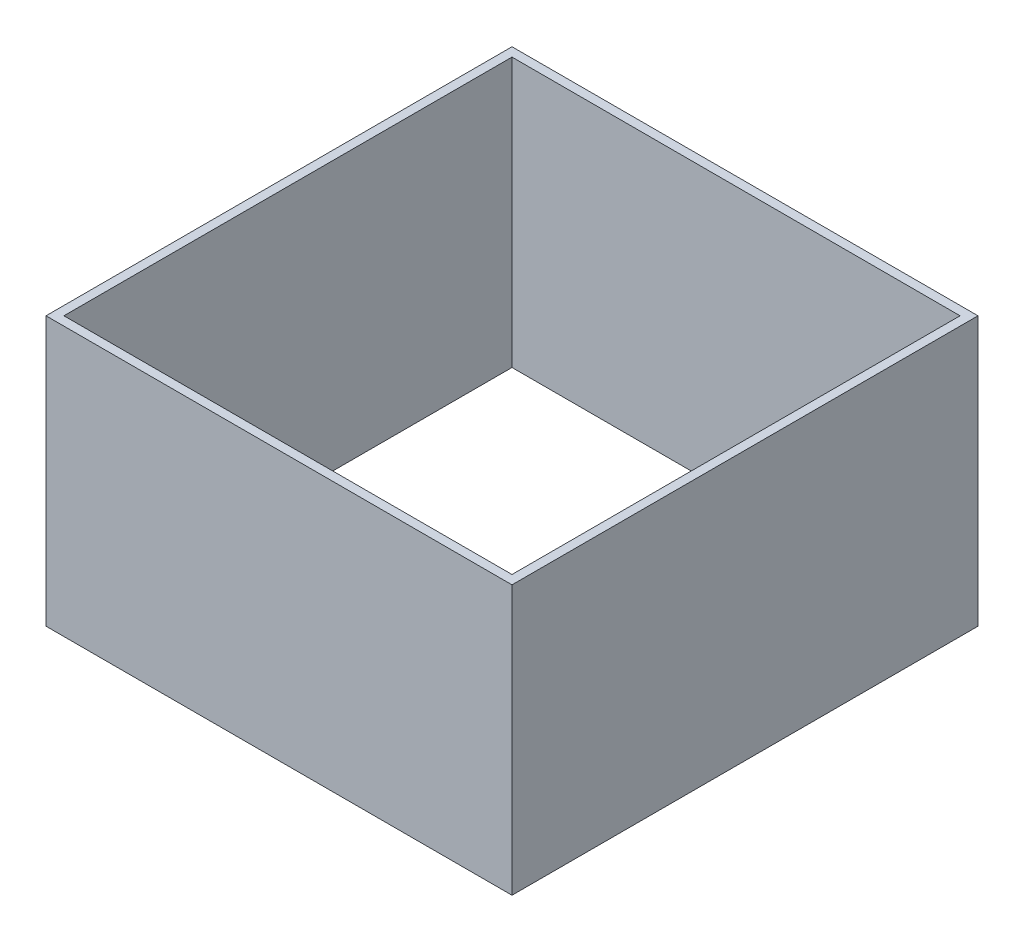
ISO-10303-21;
HEADER;
FILE_DESCRIPTION(('STEP AP214'),'2;1');
FILE_NAME('part.step','',(''),(''),'','','');
FILE_SCHEMA(('AUTOMOTIVE_DESIGN { 1 0 10303 214 1 1 1 1 }'));
ENDSEC;
DATA;
#1=APPLICATION_CONTEXT('core data for automotive mechanical design processes');
#2=APPLICATION_PROTOCOL_DEFINITION('international standard','automotive_design',2000,#1);
#3=PRODUCT_CONTEXT('',#1,'mechanical');
#4=PRODUCT('Part','Part','',(#3));
#5=PRODUCT_RELATED_PRODUCT_CATEGORY('part','',(#4));
#6=PRODUCT_DEFINITION_FORMATION('','',#4);
#7=PRODUCT_DEFINITION_CONTEXT('part definition',#1,'design');
#8=PRODUCT_DEFINITION('design','',#6,#7);
#9=PRODUCT_DEFINITION_SHAPE('','',#8);
#10=(LENGTH_UNIT() NAMED_UNIT(*) SI_UNIT(.MILLI.,.METRE.));
#11=(NAMED_UNIT(*) PLANE_ANGLE_UNIT() SI_UNIT($,.RADIAN.));
#12=(NAMED_UNIT(*) SI_UNIT($,.STERADIAN.) SOLID_ANGLE_UNIT());
#13=UNCERTAINTY_MEASURE_WITH_UNIT(LENGTH_MEASURE(1.E-05),#10,'distance_accuracy_value','');
#14=(GEOMETRIC_REPRESENTATION_CONTEXT(3) GLOBAL_UNCERTAINTY_ASSIGNED_CONTEXT((#13)) GLOBAL_UNIT_ASSIGNED_CONTEXT((#10,
#11,#12)) REPRESENTATION_CONTEXT('',''));
#15=CARTESIAN_POINT('',(0.,0.,0.));
#16=DIRECTION('',(0.,0.,1.));
#17=DIRECTION('',(1.,0.,0.));
#18=AXIS2_PLACEMENT_3D('',#15,#16,#17);
#19=CARTESIAN_POINT('',(0.,30.,0.));
#20=DIRECTION('',(0.,-1.,0.));
#21=DIRECTION('',(0.,0.,-1.));
#22=AXIS2_PLACEMENT_3D('',#19,#20,#21);
#23=PLANE('',#22);
#24=DIRECTION('',(0.,0.,1.));
#25=VECTOR('',#24,1.);
#26=CARTESIAN_POINT('',(0.,30.,0.));
#27=LINE('',#26,#25);
#28=CARTESIAN_POINT('',(0.,30.,-52.));
#29=VERTEX_POINT('',#28);
#30=CARTESIAN_POINT('',(0.,30.,0.));
#31=VERTEX_POINT('',#30);
#32=EDGE_CURVE('E153',#29,#31,#27,.T.);
#33=ORIENTED_EDGE('',*,*,#32,.T.);
#34=DIRECTION('',(1.,0.,0.));
#35=VECTOR('',#34,1.);
#36=CARTESIAN_POINT('',(0.,30.,0.));
#37=LINE('',#36,#35);
#38=CARTESIAN_POINT('',(52.,30.,0.));
#39=VERTEX_POINT('',#38);
#40=EDGE_CURVE('E157',#31,#39,#37,.T.);
#41=ORIENTED_EDGE('',*,*,#40,.T.);
#42=DIRECTION('',(0.,0.,-1.));
#43=VECTOR('',#42,1.);
#44=CARTESIAN_POINT('',(52.,30.,0.));
#45=LINE('',#44,#43);
#46=CARTESIAN_POINT('',(52.,30.,-52.));
#47=VERTEX_POINT('',#46);
#48=EDGE_CURVE('E161',#39,#47,#45,.T.);
#49=ORIENTED_EDGE('',*,*,#48,.T.);
#50=DIRECTION('',(-1.,0.,0.));
#51=VECTOR('',#50,1.);
#52=CARTESIAN_POINT('',(0.,30.,-52.));
#53=LINE('',#52,#51);
#54=EDGE_CURVE('E164',#47,#29,#53,.T.);
#55=ORIENTED_EDGE('',*,*,#54,.T.);
#56=EDGE_LOOP('',(#33,#41,#49,#55));
#57=FACE_BOUND('',#56,.T.);
#58=DIRECTION('',(0.,0.,1.));
#59=VECTOR('',#58,1.);
#60=CARTESIAN_POINT('',(1.,30.,-1.));
#61=LINE('',#60,#59);
#62=CARTESIAN_POINT('',(1.,30.,-51.));
#63=VERTEX_POINT('',#62);
#64=CARTESIAN_POINT('',(1.,30.,-1.));
#65=VERTEX_POINT('',#64);
#66=EDGE_CURVE('E105',#63,#65,#61,.T.);
#67=ORIENTED_EDGE('',*,*,#66,.F.);
#68=DIRECTION('',(-1.,0.,0.));
#69=VECTOR('',#68,1.);
#70=CARTESIAN_POINT('',(1.,30.,-51.));
#71=LINE('',#70,#69);
#72=CARTESIAN_POINT('',(51.,30.,-51.));
#73=VERTEX_POINT('',#72);
#74=EDGE_CURVE('E131',#73,#63,#71,.T.);
#75=ORIENTED_EDGE('',*,*,#74,.F.);
#76=DIRECTION('',(0.,0.,-1.));
#77=VECTOR('',#76,1.);
#78=CARTESIAN_POINT('',(51.,30.,-1.));
#79=LINE('',#78,#77);
#80=CARTESIAN_POINT('',(51.,30.,-1.));
#81=VERTEX_POINT('',#80);
#82=EDGE_CURVE('E127',#81,#73,#79,.T.);
#83=ORIENTED_EDGE('',*,*,#82,.F.);
#84=DIRECTION('',(1.,0.,0.));
#85=VECTOR('',#84,1.);
#86=CARTESIAN_POINT('',(1.,30.,-1.));
#87=LINE('',#86,#85);
#88=EDGE_CURVE('E114',#65,#81,#87,.T.);
#89=ORIENTED_EDGE('',*,*,#88,.F.);
#90=EDGE_LOOP('',(#67,#75,#83,#89));
#91=FACE_BOUND('',#90,.T.);
#92=ADVANCED_FACE('F39',(#57,#91),#23,.F.);
#93=CARTESIAN_POINT('',(0.,0.,0.));
#94=DIRECTION('',(0.,-1.,0.));
#95=DIRECTION('',(0.,0.,-1.));
#96=AXIS2_PLACEMENT_3D('',#93,#94,#95);
#97=PLANE('',#96);
#98=DIRECTION('',(0.,0.,1.));
#99=VECTOR('',#98,1.);
#100=CARTESIAN_POINT('',(0.,0.,0.));
#101=LINE('',#100,#99);
#102=CARTESIAN_POINT('',(0.,0.,-52.));
#103=VERTEX_POINT('',#102);
#104=CARTESIAN_POINT('',(0.,0.,0.));
#105=VERTEX_POINT('',#104);
#106=EDGE_CURVE('E123',#103,#105,#101,.T.);
#107=ORIENTED_EDGE('',*,*,#106,.F.);
#108=DIRECTION('',(-1.,0.,0.));
#109=VECTOR('',#108,1.);
#110=CARTESIAN_POINT('',(0.,0.,-52.));
#111=LINE('',#110,#109);
#112=CARTESIAN_POINT('',(52.,0.,-52.));
#113=VERTEX_POINT('',#112);
#114=EDGE_CURVE('E158',#113,#103,#111,.T.);
#115=ORIENTED_EDGE('',*,*,#114,.F.);
#116=DIRECTION('',(0.,0.,-1.));
#117=VECTOR('',#116,1.);
#118=CARTESIAN_POINT('',(52.,0.,0.));
#119=LINE('',#118,#117);
#120=CARTESIAN_POINT('',(52.,0.,0.));
#121=VERTEX_POINT('',#120);
#122=EDGE_CURVE('E174',#121,#113,#119,.T.);
#123=ORIENTED_EDGE('',*,*,#122,.F.);
#124=DIRECTION('',(1.,0.,0.));
#125=VECTOR('',#124,1.);
#126=CARTESIAN_POINT('',(0.,0.,0.));
#127=LINE('',#126,#125);
#128=EDGE_CURVE('E171',#105,#121,#127,.T.);
#129=ORIENTED_EDGE('',*,*,#128,.F.);
#130=EDGE_LOOP('',(#107,#115,#123,#129));
#131=FACE_BOUND('',#130,.T.);
#132=DIRECTION('',(-1.,0.,0.));
#133=VECTOR('',#132,1.);
#134=CARTESIAN_POINT('',(1.,0.,-51.));
#135=LINE('',#134,#133);
#136=CARTESIAN_POINT('',(51.,0.,-51.));
#137=VERTEX_POINT('',#136);
#138=CARTESIAN_POINT('',(1.,0.,-51.));
#139=VERTEX_POINT('',#138);
#140=EDGE_CURVE('E115',#137,#139,#135,.T.);
#141=ORIENTED_EDGE('',*,*,#140,.T.);
#142=DIRECTION('',(0.,0.,1.));
#143=VECTOR('',#142,1.);
#144=CARTESIAN_POINT('',(1.,0.,-1.));
#145=LINE('',#144,#143);
#146=CARTESIAN_POINT('',(1.,0.,-1.));
#147=VERTEX_POINT('',#146);
#148=EDGE_CURVE('E63',#139,#147,#145,.T.);
#149=ORIENTED_EDGE('',*,*,#148,.T.);
#150=DIRECTION('',(1.,0.,0.));
#151=VECTOR('',#150,1.);
#152=CARTESIAN_POINT('',(1.,0.,-1.));
#153=LINE('',#152,#151);
#154=CARTESIAN_POINT('',(51.,0.,-1.));
#155=VERTEX_POINT('',#154);
#156=EDGE_CURVE('E121',#147,#155,#153,.T.);
#157=ORIENTED_EDGE('',*,*,#156,.T.);
#158=DIRECTION('',(0.,0.,-1.));
#159=VECTOR('',#158,1.);
#160=CARTESIAN_POINT('',(51.,0.,-1.));
#161=LINE('',#160,#159);
#162=EDGE_CURVE('E140',#155,#137,#161,.T.);
#163=ORIENTED_EDGE('',*,*,#162,.T.);
#164=EDGE_LOOP('',(#141,#149,#157,#163));
#165=FACE_BOUND('',#164,.T.);
#166=ADVANCED_FACE('F197',(#131,#165),#97,.T.);
#167=CARTESIAN_POINT('',(0.,30.,0.));
#168=DIRECTION('',(1.,0.,0.));
#169=DIRECTION('',(0.,0.,-1.));
#170=AXIS2_PLACEMENT_3D('',#167,#168,#169);
#171=PLANE('',#170);
#172=ORIENTED_EDGE('',*,*,#106,.T.);
#173=DIRECTION('',(0.,-1.,0.));
#174=VECTOR('',#173,1.);
#175=CARTESIAN_POINT('',(0.,30.,0.));
#176=LINE('',#175,#174);
#177=EDGE_CURVE('E11',#31,#105,#176,.T.);
#178=ORIENTED_EDGE('',*,*,#177,.F.);
#179=ORIENTED_EDGE('',*,*,#32,.F.);
#180=DIRECTION('',(0.,-1.,0.));
#181=VECTOR('',#180,1.);
#182=CARTESIAN_POINT('',(0.,30.,-52.));
#183=LINE('',#182,#181);
#184=EDGE_CURVE('E167',#29,#103,#183,.T.);
#185=ORIENTED_EDGE('',*,*,#184,.T.);
#186=EDGE_LOOP('',(#172,#178,#179,#185));
#187=FACE_BOUND('',#186,.T.);
#188=ADVANCED_FACE('F41',(#187),#171,.F.);
#189=CARTESIAN_POINT('',(0.,30.,0.));
#190=DIRECTION('',(0.,0.,-1.));
#191=DIRECTION('',(-1.,0.,0.));
#192=AXIS2_PLACEMENT_3D('',#189,#190,#191);
#193=PLANE('',#192);
#194=ORIENTED_EDGE('',*,*,#128,.T.);
#195=DIRECTION('',(0.,-1.,0.));
#196=VECTOR('',#195,1.);
#197=CARTESIAN_POINT('',(52.,30.,0.));
#198=LINE('',#197,#196);
#199=EDGE_CURVE('E48',#39,#121,#198,.T.);
#200=ORIENTED_EDGE('',*,*,#199,.F.);
#201=ORIENTED_EDGE('',*,*,#40,.F.);
#202=ORIENTED_EDGE('',*,*,#177,.T.);
#203=EDGE_LOOP('',(#194,#200,#201,#202));
#204=FACE_BOUND('',#203,.T.);
#205=ADVANCED_FACE('F207',(#204),#193,.F.);
#206=CARTESIAN_POINT('',(52.,30.,0.));
#207=DIRECTION('',(-1.,0.,0.));
#208=DIRECTION('',(0.,0.,1.));
#209=AXIS2_PLACEMENT_3D('',#206,#207,#208);
#210=PLANE('',#209);
#211=ORIENTED_EDGE('',*,*,#122,.T.);
#212=DIRECTION('',(0.,-1.,0.));
#213=VECTOR('',#212,1.);
#214=CARTESIAN_POINT('',(52.,30.,-52.));
#215=LINE('',#214,#213);
#216=EDGE_CURVE('E182',#47,#113,#215,.T.);
#217=ORIENTED_EDGE('',*,*,#216,.F.);
#218=ORIENTED_EDGE('',*,*,#48,.F.);
#219=ORIENTED_EDGE('',*,*,#199,.T.);
#220=EDGE_LOOP('',(#211,#217,#218,#219));
#221=FACE_BOUND('',#220,.T.);
#222=ADVANCED_FACE('F191',(#221),#210,.F.);
#223=CARTESIAN_POINT('',(0.,30.,-52.));
#224=DIRECTION('',(0.,0.,1.));
#225=DIRECTION('',(1.,0.,0.));
#226=AXIS2_PLACEMENT_3D('',#223,#224,#225);
#227=PLANE('',#226);
#228=ORIENTED_EDGE('',*,*,#114,.T.);
#229=ORIENTED_EDGE('',*,*,#184,.F.);
#230=ORIENTED_EDGE('',*,*,#54,.F.);
#231=ORIENTED_EDGE('',*,*,#216,.T.);
#232=EDGE_LOOP('',(#228,#229,#230,#231));
#233=FACE_BOUND('',#232,.T.);
#234=ADVANCED_FACE('F201',(#233),#227,.F.);
#235=CARTESIAN_POINT('',(1.,30.,-1.));
#236=DIRECTION('',(1.,0.,0.));
#237=DIRECTION('',(0.,0.,-1.));
#238=AXIS2_PLACEMENT_3D('',#235,#236,#237);
#239=PLANE('',#238);
#240=ORIENTED_EDGE('',*,*,#148,.F.);
#241=DIRECTION('',(0.,-1.,0.));
#242=VECTOR('',#241,1.);
#243=CARTESIAN_POINT('',(1.,30.,-51.));
#244=LINE('',#243,#242);
#245=EDGE_CURVE('E109',#63,#139,#244,.T.);
#246=ORIENTED_EDGE('',*,*,#245,.F.);
#247=ORIENTED_EDGE('',*,*,#66,.T.);
#248=DIRECTION('',(0.,-1.,0.));
#249=VECTOR('',#248,1.);
#250=CARTESIAN_POINT('',(1.,30.,-1.));
#251=LINE('',#250,#249);
#252=EDGE_CURVE('E108',#65,#147,#251,.T.);
#253=ORIENTED_EDGE('',*,*,#252,.T.);
#254=EDGE_LOOP('',(#240,#246,#247,#253));
#255=FACE_BOUND('',#254,.T.);
#256=ADVANCED_FACE('F107',(#255),#239,.T.);
#257=CARTESIAN_POINT('',(1.,30.,-1.));
#258=DIRECTION('',(0.,0.,-1.));
#259=DIRECTION('',(-1.,0.,0.));
#260=AXIS2_PLACEMENT_3D('',#257,#258,#259);
#261=PLANE('',#260);
#262=ORIENTED_EDGE('',*,*,#156,.F.);
#263=ORIENTED_EDGE('',*,*,#252,.F.);
#264=ORIENTED_EDGE('',*,*,#88,.T.);
#265=DIRECTION('',(0.,-1.,0.));
#266=VECTOR('',#265,1.);
#267=CARTESIAN_POINT('',(51.,30.,-1.));
#268=LINE('',#267,#266);
#269=EDGE_CURVE('E124',#81,#155,#268,.T.);
#270=ORIENTED_EDGE('',*,*,#269,.T.);
#271=EDGE_LOOP('',(#262,#263,#264,#270));
#272=FACE_BOUND('',#271,.T.);
#273=ADVANCED_FACE('F118',(#272),#261,.T.);
#274=CARTESIAN_POINT('',(51.,30.,-1.));
#275=DIRECTION('',(-1.,0.,0.));
#276=DIRECTION('',(0.,0.,1.));
#277=AXIS2_PLACEMENT_3D('',#274,#275,#276);
#278=PLANE('',#277);
#279=ORIENTED_EDGE('',*,*,#162,.F.);
#280=ORIENTED_EDGE('',*,*,#269,.F.);
#281=ORIENTED_EDGE('',*,*,#82,.T.);
#282=DIRECTION('',(0.,-1.,0.));
#283=VECTOR('',#282,1.);
#284=CARTESIAN_POINT('',(51.,30.,-51.));
#285=LINE('',#284,#283);
#286=EDGE_CURVE('E55',#73,#137,#285,.T.);
#287=ORIENTED_EDGE('',*,*,#286,.T.);
#288=EDGE_LOOP('',(#279,#280,#281,#287));
#289=FACE_BOUND('',#288,.T.);
#290=ADVANCED_FACE('F230',(#289),#278,.T.);
#291=CARTESIAN_POINT('',(1.,30.,-51.));
#292=DIRECTION('',(0.,0.,1.));
#293=DIRECTION('',(1.,0.,0.));
#294=AXIS2_PLACEMENT_3D('',#291,#292,#293);
#295=PLANE('',#294);
#296=ORIENTED_EDGE('',*,*,#140,.F.);
#297=ORIENTED_EDGE('',*,*,#286,.F.);
#298=ORIENTED_EDGE('',*,*,#74,.T.);
#299=ORIENTED_EDGE('',*,*,#245,.T.);
#300=EDGE_LOOP('',(#296,#297,#298,#299));
#301=FACE_BOUND('',#300,.T.);
#302=ADVANCED_FACE('F234',(#301),#295,.T.);
#303=CLOSED_SHELL('',(#92,#166,#188,#205,#222,#234,#256,#273,#290,#302));
#304=MANIFOLD_SOLID_BREP('B2',#303);
#305=ADVANCED_BREP_SHAPE_REPRESENTATION('',(#18,#304),#14);
#306=SHAPE_DEFINITION_REPRESENTATION(#9,#305);
ENDSEC;
END-ISO-10303-21;
